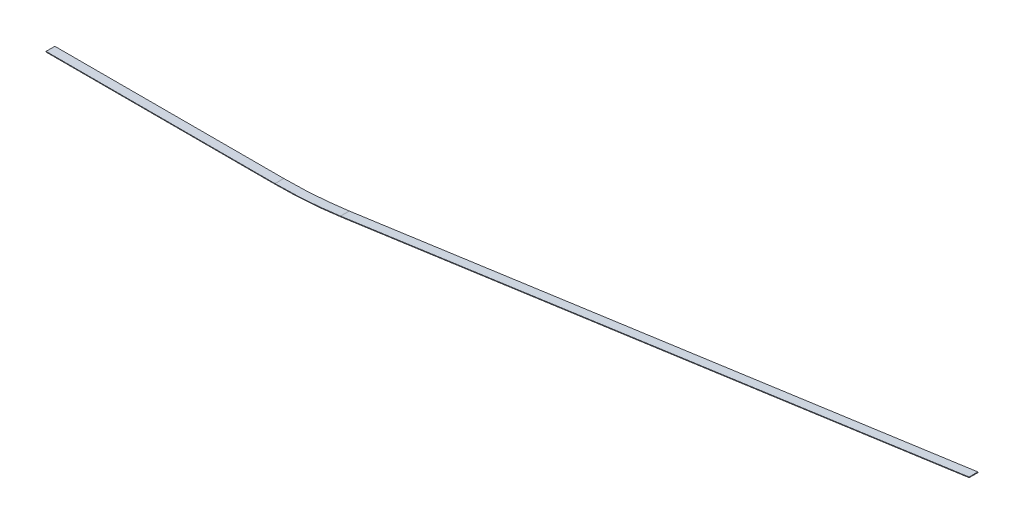
ISO-10303-21;
HEADER;
FILE_DESCRIPTION(('STEP AP214'),'2;1');
FILE_NAME('part.step','',(''),(''),'','','');
FILE_SCHEMA(('AUTOMOTIVE_DESIGN { 1 0 10303 214 1 1 1 1 }'));
ENDSEC;
DATA;
#1=APPLICATION_CONTEXT('core data for automotive mechanical design processes');
#2=APPLICATION_PROTOCOL_DEFINITION('international standard','automotive_design',2000,#1);
#3=PRODUCT_CONTEXT('',#1,'mechanical');
#4=PRODUCT('Part','Part','',(#3));
#5=PRODUCT_RELATED_PRODUCT_CATEGORY('part','',(#4));
#6=PRODUCT_DEFINITION_FORMATION('','',#4);
#7=PRODUCT_DEFINITION_CONTEXT('part definition',#1,'design');
#8=PRODUCT_DEFINITION('design','',#6,#7);
#9=PRODUCT_DEFINITION_SHAPE('','',#8);
#10=(LENGTH_UNIT() NAMED_UNIT(*) SI_UNIT(.MILLI.,.METRE.));
#11=(NAMED_UNIT(*) PLANE_ANGLE_UNIT() SI_UNIT($,.RADIAN.));
#12=(NAMED_UNIT(*) SI_UNIT($,.STERADIAN.) SOLID_ANGLE_UNIT());
#13=UNCERTAINTY_MEASURE_WITH_UNIT(LENGTH_MEASURE(1.E-05),#10,'distance_accuracy_value','');
#14=(GEOMETRIC_REPRESENTATION_CONTEXT(3) GLOBAL_UNCERTAINTY_ASSIGNED_CONTEXT((#13)) GLOBAL_UNIT_ASSIGNED_CONTEXT((#10,
#11,#12)) REPRESENTATION_CONTEXT('',''));
#15=CARTESIAN_POINT('',(0.,0.,0.));
#16=DIRECTION('',(0.,0.,1.));
#17=DIRECTION('',(1.,0.,0.));
#18=AXIS2_PLACEMENT_3D('',#15,#16,#17);
#19=CARTESIAN_POINT('',(5501.69221697348,2965.86739895074,-9.525));
#20=DIRECTION('',(0.,1.,0.));
#21=DIRECTION('',(-1.,0.,0.));
#22=AXIS2_PLACEMENT_3D('',#19,#20,#21);
#23=PLANE('',#22);
#24=DIRECTION('',(1.,0.,0.));
#25=VECTOR('',#24,1.);
#26=CARTESIAN_POINT('',(5501.69221697348,2965.86739895074,0.));
#27=LINE('',#26,#25);
#28=CARTESIAN_POINT('',(5501.69221697348,2965.86739895074,0.));
#29=VERTEX_POINT('',#28);
#30=CARTESIAN_POINT('',(5748.74439650617,2965.86739895074,0.));
#31=VERTEX_POINT('',#30);
#32=EDGE_CURVE('E130',#29,#31,#27,.T.);
#33=ORIENTED_EDGE('',*,*,#32,.F.);
#34=DIRECTION('',(0.,0.,1.));
#35=VECTOR('',#34,1.);
#36=CARTESIAN_POINT('',(5501.69221697348,2965.86739895074,-9.525));
#37=LINE('',#36,#35);
#38=CARTESIAN_POINT('',(5501.69221697348,2965.86739895074,-9.525));
#39=VERTEX_POINT('',#38);
#40=EDGE_CURVE('E129',#39,#29,#37,.T.);
#41=ORIENTED_EDGE('',*,*,#40,.F.);
#42=DIRECTION('',(1.,0.,0.));
#43=VECTOR('',#42,1.);
#44=CARTESIAN_POINT('',(5501.69221697348,2965.86739895074,-9.525));
#45=LINE('',#44,#43);
#46=CARTESIAN_POINT('',(5748.74439650617,2965.86739895074,-9.525));
#47=VERTEX_POINT('',#46);
#48=EDGE_CURVE('E148',#39,#47,#45,.T.);
#49=ORIENTED_EDGE('',*,*,#48,.T.);
#50=DIRECTION('',(0.,0.,1.));
#51=VECTOR('',#50,1.);
#52=CARTESIAN_POINT('',(5748.74439650617,2965.86739895074,-9.525));
#53=LINE('',#52,#51);
#54=EDGE_CURVE('E11',#47,#31,#53,.T.);
#55=ORIENTED_EDGE('',*,*,#54,.T.);
#56=EDGE_LOOP('',(#33,#41,#49,#55));
#57=FACE_BOUND('',#56,.T.);
#58=ADVANCED_FACE('F34',(#57),#23,.F.);
#59=CARTESIAN_POINT('',(5748.74439650617,3474.50239895074,-9.525));
#60=DIRECTION('',(0.,0.,1.));
#61=DIRECTION('',(-1.,0.,0.));
#62=AXIS2_PLACEMENT_3D('',#59,#60,#61);
#63=CYLINDRICAL_SURFACE('',#62,508.635000000001);
#64=CARTESIAN_POINT('',(5748.74439650617,3474.50239895074,0.));
#65=DIRECTION('',(0.,0.,1.));
#66=DIRECTION('',(1.,0.,0.));
#67=AXIS2_PLACEMENT_3D('',#64,#65,#66);
#68=CIRCLE('',#67,508.635000000001);
#69=CARTESIAN_POINT('',(5819.532706713,2970.81739980637,0.));
#70=VERTEX_POINT('',#69);
#71=EDGE_CURVE('E132',#31,#70,#68,.T.);
#72=ORIENTED_EDGE('',*,*,#71,.F.);
#73=ORIENTED_EDGE('',*,*,#54,.F.);
#74=CARTESIAN_POINT('',(5748.74439650617,3474.50239895074,-9.525));
#75=DIRECTION('',(0.,0.,1.));
#76=DIRECTION('',(1.,0.,0.));
#77=AXIS2_PLACEMENT_3D('',#74,#75,#76);
#78=CIRCLE('',#77,508.635000000001);
#79=CARTESIAN_POINT('',(5819.532706713,2970.81739980637,-9.525));
#80=VERTEX_POINT('',#79);
#81=EDGE_CURVE('E88',#47,#80,#78,.T.);
#82=ORIENTED_EDGE('',*,*,#81,.T.);
#83=DIRECTION('',(0.,0.,1.));
#84=VECTOR('',#83,1.);
#85=CARTESIAN_POINT('',(5819.532706713,2970.81739980637,-9.525));
#86=LINE('',#85,#84);
#87=EDGE_CURVE('E42',#80,#70,#86,.T.);
#88=ORIENTED_EDGE('',*,*,#87,.T.);
#89=EDGE_LOOP('',(#72,#73,#82,#88));
#90=FACE_BOUND('',#89,.T.);
#91=ADVANCED_FACE('F160',(#90),#63,.T.);
#92=CARTESIAN_POINT('',(5819.532706713,2970.81739980637,-9.525));
#93=DIRECTION('',(-0.139173100960063,0.990268068741571,0.));
#94=DIRECTION('',(-0.990268068741571,-0.139173100960063,0.));
#95=AXIS2_PLACEMENT_3D('',#92,#93,#94);
#96=PLANE('',#95);
#97=DIRECTION('',(0.990268068741571,0.139173100960063,0.));
#98=VECTOR('',#97,1.);
#99=CARTESIAN_POINT('',(5819.532706713,2970.81739980637,0.));
#100=LINE('',#99,#98);
#101=CARTESIAN_POINT('',(6497.73059189259,3066.13189668291,0.));
#102=VERTEX_POINT('',#101);
#103=EDGE_CURVE('E135',#70,#102,#100,.T.);
#104=ORIENTED_EDGE('',*,*,#103,.F.);
#105=ORIENTED_EDGE('',*,*,#87,.F.);
#106=DIRECTION('',(0.990268068741571,0.139173100960063,0.));
#107=VECTOR('',#106,1.);
#108=CARTESIAN_POINT('',(5819.532706713,2970.81739980637,-9.525));
#109=LINE('',#108,#107);
#110=CARTESIAN_POINT('',(6497.73059189259,3066.13189668291,-9.525));
#111=VERTEX_POINT('',#110);
#112=EDGE_CURVE('E169',#80,#111,#109,.T.);
#113=ORIENTED_EDGE('',*,*,#112,.T.);
#114=DIRECTION('',(0.,0.,1.));
#115=VECTOR('',#114,1.);
#116=CARTESIAN_POINT('',(6497.73059189259,3066.13189668291,-9.525));
#117=LINE('',#116,#115);
#118=EDGE_CURVE('E155',#111,#102,#117,.T.);
#119=ORIENTED_EDGE('',*,*,#118,.T.);
#120=EDGE_LOOP('',(#104,#105,#113,#119));
#121=FACE_BOUND('',#120,.T.);
#122=ADVANCED_FACE('F179',(#121),#96,.F.);
#123=CARTESIAN_POINT('',(6497.73059189259,3066.13189668291,-9.525));
#124=DIRECTION('',(-0.990268068741545,-0.139173100960247,0.));
#125=DIRECTION('',(0.139173100960247,-0.990268068741545,0.));
#126=AXIS2_PLACEMENT_3D('',#123,#124,#125);
#127=PLANE('',#126);
#128=DIRECTION('',(-0.139173100960247,0.990268068741545,0.));
#129=VECTOR('',#128,1.);
#130=CARTESIAN_POINT('',(6497.73059189259,3066.13189668291,0.));
#131=LINE('',#130,#129);
#132=CARTESIAN_POINT('',(6497.64221697348,3066.76071690656,0.));
#133=VERTEX_POINT('',#132);
#134=EDGE_CURVE('E138',#102,#133,#131,.T.);
#135=ORIENTED_EDGE('',*,*,#134,.F.);
#136=ORIENTED_EDGE('',*,*,#118,.F.);
#137=DIRECTION('',(-0.139173100960247,0.990268068741545,0.));
#138=VECTOR('',#137,1.);
#139=CARTESIAN_POINT('',(6497.73059189259,3066.13189668291,-9.525));
#140=LINE('',#139,#138);
#141=CARTESIAN_POINT('',(6497.64221697348,3066.76071690656,-9.525));
#142=VERTEX_POINT('',#141);
#143=EDGE_CURVE('E124',#111,#142,#140,.T.);
#144=ORIENTED_EDGE('',*,*,#143,.T.);
#145=DIRECTION('',(0.,0.,1.));
#146=VECTOR('',#145,1.);
#147=CARTESIAN_POINT('',(6497.64221697348,3066.76071690656,-9.525));
#148=LINE('',#147,#146);
#149=EDGE_CURVE('E152',#142,#133,#148,.T.);
#150=ORIENTED_EDGE('',*,*,#149,.T.);
#151=EDGE_LOOP('',(#135,#136,#144,#150));
#152=FACE_BOUND('',#151,.T.);
#153=ADVANCED_FACE('F175',(#152),#127,.F.);
#154=CARTESIAN_POINT('',(5819.44433179389,2971.44622003003,-9.525));
#155=DIRECTION('',(0.139173100960063,-0.990268068741571,0.));
#156=DIRECTION('',(0.990268068741571,0.139173100960063,0.));
#157=AXIS2_PLACEMENT_3D('',#154,#155,#156);
#158=PLANE('',#157);
#159=DIRECTION('',(-0.990268068741571,-0.139173100960063,0.));
#160=VECTOR('',#159,1.);
#161=CARTESIAN_POINT('',(5819.44433179389,2971.44622003003,0.));
#162=LINE('',#161,#160);
#163=CARTESIAN_POINT('',(5819.44433179389,2971.44622003003,0.));
#164=VERTEX_POINT('',#163);
#165=EDGE_CURVE('E141',#133,#164,#162,.T.);
#166=ORIENTED_EDGE('',*,*,#165,.F.);
#167=ORIENTED_EDGE('',*,*,#149,.F.);
#168=DIRECTION('',(-0.990268068741571,-0.139173100960063,0.));
#169=VECTOR('',#168,1.);
#170=CARTESIAN_POINT('',(5819.44433179389,2971.44622003003,-9.525));
#171=LINE('',#170,#169);
#172=CARTESIAN_POINT('',(5819.44433179389,2971.44622003003,-9.525));
#173=VERTEX_POINT('',#172);
#174=EDGE_CURVE('E122',#142,#173,#171,.T.);
#175=ORIENTED_EDGE('',*,*,#174,.T.);
#176=DIRECTION('',(0.,0.,1.));
#177=VECTOR('',#176,1.);
#178=CARTESIAN_POINT('',(5819.44433179389,2971.44622003003,-9.525));
#179=LINE('',#178,#177);
#180=EDGE_CURVE('E116',#173,#164,#179,.T.);
#181=ORIENTED_EDGE('',*,*,#180,.T.);
#182=EDGE_LOOP('',(#166,#167,#175,#181));
#183=FACE_BOUND('',#182,.T.);
#184=ADVANCED_FACE('F178',(#183),#158,.F.);
#185=CARTESIAN_POINT('',(5748.74439650617,3474.50239895074,-9.525));
#186=DIRECTION('',(0.,0.,1.));
#187=DIRECTION('',(-1.,0.,0.));
#188=AXIS2_PLACEMENT_3D('',#185,#186,#187);
#189=CYLINDRICAL_SURFACE('',#188,508.);
#190=CARTESIAN_POINT('',(5748.74439650617,3474.50239895074,0.));
#191=DIRECTION('',(0.,0.,-1.));
#192=DIRECTION('',(1.,0.,0.));
#193=AXIS2_PLACEMENT_3D('',#190,#191,#192);
#194=CIRCLE('',#193,508.);
#195=CARTESIAN_POINT('',(5748.74439650617,2966.50239895074,0.));
#196=VERTEX_POINT('',#195);
#197=EDGE_CURVE('E144',#164,#196,#194,.T.);
#198=ORIENTED_EDGE('',*,*,#197,.F.);
#199=ORIENTED_EDGE('',*,*,#180,.F.);
#200=CARTESIAN_POINT('',(5748.74439650617,3474.50239895074,-9.525));
#201=DIRECTION('',(0.,0.,-1.));
#202=DIRECTION('',(1.,0.,0.));
#203=AXIS2_PLACEMENT_3D('',#200,#201,#202);
#204=CIRCLE('',#203,508.);
#205=CARTESIAN_POINT('',(5748.74439650617,2966.50239895074,-9.525));
#206=VERTEX_POINT('',#205);
#207=EDGE_CURVE('E106',#173,#206,#204,.T.);
#208=ORIENTED_EDGE('',*,*,#207,.T.);
#209=DIRECTION('',(0.,0.,1.));
#210=VECTOR('',#209,1.);
#211=CARTESIAN_POINT('',(5748.74439650617,2966.50239895074,-9.525));
#212=LINE('',#211,#210);
#213=EDGE_CURVE('E111',#206,#196,#212,.T.);
#214=ORIENTED_EDGE('',*,*,#213,.T.);
#215=EDGE_LOOP('',(#198,#199,#208,#214));
#216=FACE_BOUND('',#215,.T.);
#217=ADVANCED_FACE('F119',(#216),#189,.F.);
#218=CARTESIAN_POINT('',(5501.69221697348,2966.50239895074,-9.525));
#219=DIRECTION('',(0.,-1.,0.));
#220=DIRECTION('',(1.,0.,0.));
#221=AXIS2_PLACEMENT_3D('',#218,#219,#220);
#222=PLANE('',#221);
#223=DIRECTION('',(-1.,0.,0.));
#224=VECTOR('',#223,1.);
#225=CARTESIAN_POINT('',(5501.69221697348,2966.50239895074,0.));
#226=LINE('',#225,#224);
#227=CARTESIAN_POINT('',(5501.69221697348,2966.50239895074,0.));
#228=VERTEX_POINT('',#227);
#229=EDGE_CURVE('E113',#196,#228,#226,.T.);
#230=ORIENTED_EDGE('',*,*,#229,.F.);
#231=ORIENTED_EDGE('',*,*,#213,.F.);
#232=DIRECTION('',(-1.,0.,0.));
#233=VECTOR('',#232,1.);
#234=CARTESIAN_POINT('',(5501.69221697348,2966.50239895074,-9.525));
#235=LINE('',#234,#233);
#236=CARTESIAN_POINT('',(5501.69221697348,2966.50239895074,-9.525));
#237=VERTEX_POINT('',#236);
#238=EDGE_CURVE('E102',#206,#237,#235,.T.);
#239=ORIENTED_EDGE('',*,*,#238,.T.);
#240=DIRECTION('',(0.,0.,1.));
#241=VECTOR('',#240,1.);
#242=CARTESIAN_POINT('',(5501.69221697348,2966.50239895074,-9.525));
#243=LINE('',#242,#241);
#244=EDGE_CURVE('E117',#237,#228,#243,.T.);
#245=ORIENTED_EDGE('',*,*,#244,.T.);
#246=EDGE_LOOP('',(#230,#231,#239,#245));
#247=FACE_BOUND('',#246,.T.);
#248=ADVANCED_FACE('F112',(#247),#222,.F.);
#249=CARTESIAN_POINT('',(5501.69221697348,2965.86739895074,-9.525));
#250=DIRECTION('',(1.,0.,0.));
#251=DIRECTION('',(0.,0.,1.));
#252=AXIS2_PLACEMENT_3D('',#249,#250,#251);
#253=PLANE('',#252);
#254=DIRECTION('',(0.,-1.,0.));
#255=VECTOR('',#254,1.);
#256=CARTESIAN_POINT('',(5501.69221697348,2965.86739895074,0.));
#257=LINE('',#256,#255);
#258=EDGE_CURVE('E76',#228,#29,#257,.T.);
#259=ORIENTED_EDGE('',*,*,#258,.F.);
#260=ORIENTED_EDGE('',*,*,#244,.F.);
#261=DIRECTION('',(0.,-1.,0.));
#262=VECTOR('',#261,1.);
#263=CARTESIAN_POINT('',(5501.69221697348,2965.86739895074,-9.525));
#264=LINE('',#263,#262);
#265=EDGE_CURVE('E50',#237,#39,#264,.T.);
#266=ORIENTED_EDGE('',*,*,#265,.T.);
#267=ORIENTED_EDGE('',*,*,#40,.T.);
#268=EDGE_LOOP('',(#259,#260,#266,#267));
#269=FACE_BOUND('',#268,.T.);
#270=ADVANCED_FACE('F229',(#269),#253,.F.);
#271=CARTESIAN_POINT('',(5748.74439650617,3474.50239895074,-9.525));
#272=DIRECTION('',(0.,0.,-1.));
#273=DIRECTION('',(1.,0.,0.));
#274=AXIS2_PLACEMENT_3D('',#271,#272,#273);
#275=PLANE('',#274);
#276=ORIENTED_EDGE('',*,*,#48,.F.);
#277=ORIENTED_EDGE('',*,*,#265,.F.);
#278=ORIENTED_EDGE('',*,*,#238,.F.);
#279=ORIENTED_EDGE('',*,*,#207,.F.);
#280=ORIENTED_EDGE('',*,*,#174,.F.);
#281=ORIENTED_EDGE('',*,*,#143,.F.);
#282=ORIENTED_EDGE('',*,*,#112,.F.);
#283=ORIENTED_EDGE('',*,*,#81,.F.);
#284=EDGE_LOOP('',(#276,#277,#278,#279,#280,#281,#282,#283));
#285=FACE_BOUND('',#284,.T.);
#286=ADVANCED_FACE('F104',(#285),#275,.T.);
#287=CARTESIAN_POINT('',(5748.74439650617,3474.50239895074,0.));
#288=DIRECTION('',(0.,0.,-1.));
#289=DIRECTION('',(1.,0.,0.));
#290=AXIS2_PLACEMENT_3D('',#287,#288,#289);
#291=PLANE('',#290);
#292=ORIENTED_EDGE('',*,*,#32,.T.);
#293=ORIENTED_EDGE('',*,*,#71,.T.);
#294=ORIENTED_EDGE('',*,*,#103,.T.);
#295=ORIENTED_EDGE('',*,*,#134,.T.);
#296=ORIENTED_EDGE('',*,*,#165,.T.);
#297=ORIENTED_EDGE('',*,*,#197,.T.);
#298=ORIENTED_EDGE('',*,*,#229,.T.);
#299=ORIENTED_EDGE('',*,*,#258,.T.);
#300=EDGE_LOOP('',(#292,#293,#294,#295,#296,#297,#298,#299));
#301=FACE_BOUND('',#300,.T.);
#302=ADVANCED_FACE('F163',(#301),#291,.F.);
#303=CLOSED_SHELL('',(#58,#91,#122,#153,#184,#217,#248,#270,#286,#302));
#304=MANIFOLD_SOLID_BREP('B2',#303);
#305=ADVANCED_BREP_SHAPE_REPRESENTATION('',(#18,#304),#14);
#306=SHAPE_DEFINITION_REPRESENTATION(#9,#305);
ENDSEC;
END-ISO-10303-21;
